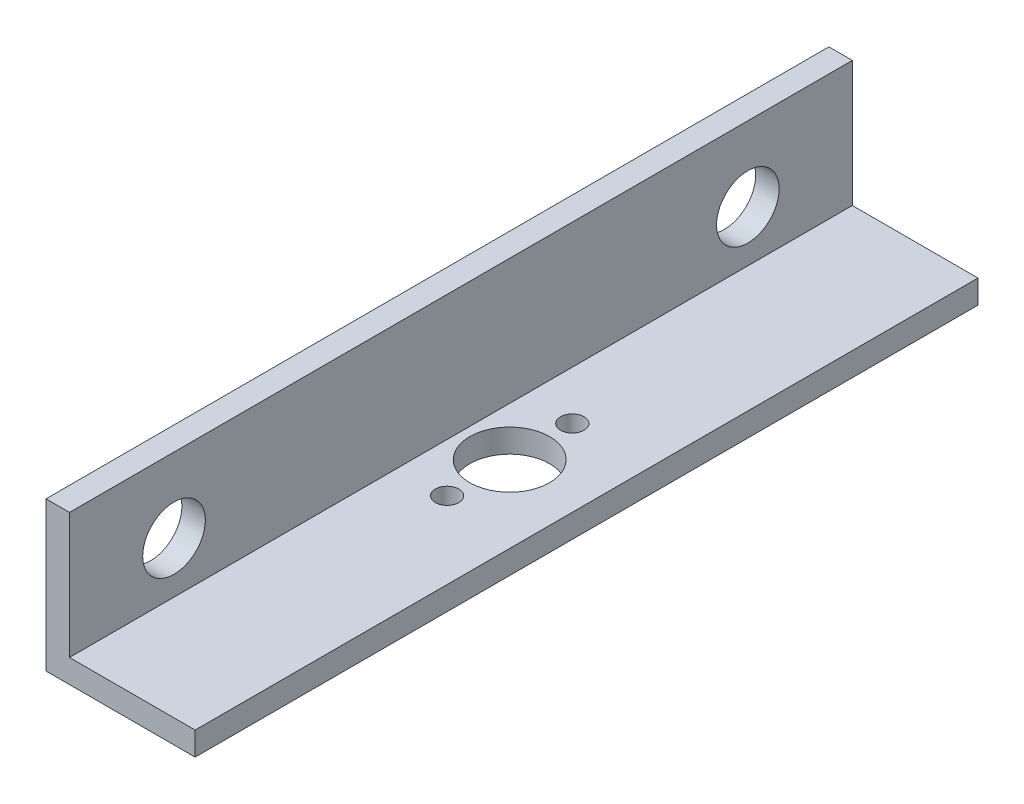
ISO-10303-21;
HEADER;
FILE_DESCRIPTION(('STEP AP214'),'2;1');
FILE_NAME('part.step','',(''),(''),'','','');
FILE_SCHEMA(('AUTOMOTIVE_DESIGN { 1 0 10303 214 1 1 1 1 }'));
ENDSEC;
DATA;
#1=APPLICATION_CONTEXT('core data for automotive mechanical design processes');
#2=APPLICATION_PROTOCOL_DEFINITION('international standard','automotive_design',2000,#1);
#3=PRODUCT_CONTEXT('',#1,'mechanical');
#4=PRODUCT('Part','Part','',(#3));
#5=PRODUCT_RELATED_PRODUCT_CATEGORY('part','',(#4));
#6=PRODUCT_DEFINITION_FORMATION('','',#4);
#7=PRODUCT_DEFINITION_CONTEXT('part definition',#1,'design');
#8=PRODUCT_DEFINITION('design','',#6,#7);
#9=PRODUCT_DEFINITION_SHAPE('','',#8);
#10=(LENGTH_UNIT() NAMED_UNIT(*) SI_UNIT(.MILLI.,.METRE.));
#11=(NAMED_UNIT(*) PLANE_ANGLE_UNIT() SI_UNIT($,.RADIAN.));
#12=(NAMED_UNIT(*) SI_UNIT($,.STERADIAN.) SOLID_ANGLE_UNIT());
#13=UNCERTAINTY_MEASURE_WITH_UNIT(LENGTH_MEASURE(1.E-05),#10,'distance_accuracy_value','');
#14=(GEOMETRIC_REPRESENTATION_CONTEXT(3) GLOBAL_UNCERTAINTY_ASSIGNED_CONTEXT((#13)) GLOBAL_UNIT_ASSIGNED_CONTEXT((#10,
#11,#12)) REPRESENTATION_CONTEXT('',''));
#15=CARTESIAN_POINT('',(0.,0.,0.));
#16=DIRECTION('',(0.,0.,1.));
#17=DIRECTION('',(1.,0.,0.));
#18=AXIS2_PLACEMENT_3D('',#15,#16,#17);
#19=CARTESIAN_POINT('',(3.,0.,50.));
#20=DIRECTION('',(-1.,0.,0.));
#21=DIRECTION('',(0.,0.,1.));
#22=AXIS2_PLACEMENT_3D('',#19,#20,#21);
#23=PLANE('',#22);
#24=CARTESIAN_POINT('',(3.,9.52500000000001,36.65));
#25=DIRECTION('',(-1.,0.,0.));
#26=DIRECTION('',(0.,0.,1.));
#27=AXIS2_PLACEMENT_3D('',#24,#25,#26);
#28=CIRCLE('',#27,3.99999999999999);
#29=CARTESIAN_POINT('',(3.,9.52500000000001,40.65));
#30=VERTEX_POINT('',#29);
#31=EDGE_CURVE('E164',#30,#30,#28,.F.);
#32=ORIENTED_EDGE('',*,*,#31,.F.);
#33=EDGE_LOOP('',(#32));
#34=FACE_BOUND('',#33,.T.);
#35=CARTESIAN_POINT('',(3.,9.52500000000001,-36.65));
#36=DIRECTION('',(-1.,0.,0.));
#37=DIRECTION('',(0.,0.,1.));
#38=AXIS2_PLACEMENT_3D('',#35,#36,#37);
#39=CIRCLE('',#38,3.99999999999999);
#40=CARTESIAN_POINT('',(3.,9.52500000000001,-32.65));
#41=VERTEX_POINT('',#40);
#42=EDGE_CURVE('E120',#41,#41,#39,.F.);
#43=ORIENTED_EDGE('',*,*,#42,.F.);
#44=EDGE_LOOP('',(#43));
#45=FACE_BOUND('',#44,.T.);
#46=DIRECTION('',(0.,1.,0.));
#47=VECTOR('',#46,1.);
#48=CARTESIAN_POINT('',(3.,0.,-50.));
#49=LINE('',#48,#47);
#50=CARTESIAN_POINT('',(3.,3.,-50.));
#51=VERTEX_POINT('',#50);
#52=CARTESIAN_POINT('',(3.,19.05,-50.));
#53=VERTEX_POINT('',#52);
#54=EDGE_CURVE('E116',#51,#53,#49,.T.);
#55=ORIENTED_EDGE('',*,*,#54,.T.);
#56=DIRECTION('',(0.,0.,-1.));
#57=VECTOR('',#56,1.);
#58=CARTESIAN_POINT('',(3.,19.05,50.));
#59=LINE('',#58,#57);
#60=CARTESIAN_POINT('',(3.,19.05,50.));
#61=VERTEX_POINT('',#60);
#62=EDGE_CURVE('E11',#61,#53,#59,.T.);
#63=ORIENTED_EDGE('',*,*,#62,.F.);
#64=DIRECTION('',(0.,1.,0.));
#65=VECTOR('',#64,1.);
#66=CARTESIAN_POINT('',(3.,0.,50.));
#67=LINE('',#66,#65);
#68=CARTESIAN_POINT('',(3.,3.,50.));
#69=VERTEX_POINT('',#68);
#70=EDGE_CURVE('E81',#69,#61,#67,.T.);
#71=ORIENTED_EDGE('',*,*,#70,.F.);
#72=DIRECTION('',(0.,0.,-1.));
#73=VECTOR('',#72,1.);
#74=CARTESIAN_POINT('',(3.,3.,50.));
#75=LINE('',#74,#73);
#76=EDGE_CURVE('E112',#69,#51,#75,.T.);
#77=ORIENTED_EDGE('',*,*,#76,.T.);
#78=EDGE_LOOP('',(#55,#63,#71,#77));
#79=FACE_BOUND('',#78,.T.);
#80=ADVANCED_FACE('F35',(#34,#45,#79),#23,.F.);
#81=CARTESIAN_POINT('',(0.,19.05,50.));
#82=DIRECTION('',(0.,1.,0.));
#83=DIRECTION('',(0.,0.,1.));
#84=AXIS2_PLACEMENT_3D('',#81,#82,#83);
#85=PLANE('',#84);
#86=DIRECTION('',(1.,0.,0.));
#87=VECTOR('',#86,1.);
#88=CARTESIAN_POINT('',(0.,19.05,-50.));
#89=LINE('',#88,#87);
#90=CARTESIAN_POINT('',(0.,19.05,-50.));
#91=VERTEX_POINT('',#90);
#92=EDGE_CURVE('E119',#91,#53,#89,.T.);
#93=ORIENTED_EDGE('',*,*,#92,.F.);
#94=DIRECTION('',(0.,0.,-1.));
#95=VECTOR('',#94,1.);
#96=CARTESIAN_POINT('',(0.,19.05,50.));
#97=LINE('',#96,#95);
#98=CARTESIAN_POINT('',(0.,19.05,50.));
#99=VERTEX_POINT('',#98);
#100=EDGE_CURVE('E43',#99,#91,#97,.T.);
#101=ORIENTED_EDGE('',*,*,#100,.F.);
#102=DIRECTION('',(1.,0.,0.));
#103=VECTOR('',#102,1.);
#104=CARTESIAN_POINT('',(0.,19.05,50.));
#105=LINE('',#104,#103);
#106=EDGE_CURVE('E175',#99,#61,#105,.T.);
#107=ORIENTED_EDGE('',*,*,#106,.T.);
#108=ORIENTED_EDGE('',*,*,#62,.T.);
#109=EDGE_LOOP('',(#93,#101,#107,#108));
#110=FACE_BOUND('',#109,.T.);
#111=ADVANCED_FACE('F138',(#110),#85,.T.);
#112=CARTESIAN_POINT('',(0.,0.,50.));
#113=DIRECTION('',(-1.,0.,0.));
#114=DIRECTION('',(0.,0.,1.));
#115=AXIS2_PLACEMENT_3D('',#112,#113,#114);
#116=PLANE('',#115);
#117=CARTESIAN_POINT('',(0.,9.52500000000001,36.65));
#118=DIRECTION('',(-1.,0.,0.));
#119=DIRECTION('',(0.,0.,1.));
#120=AXIS2_PLACEMENT_3D('',#117,#118,#119);
#121=CIRCLE('',#120,3.99999999999999);
#122=CARTESIAN_POINT('',(0.,9.52500000000001,40.65));
#123=VERTEX_POINT('',#122);
#124=EDGE_CURVE('E177',#123,#123,#121,.T.);
#125=ORIENTED_EDGE('',*,*,#124,.F.);
#126=EDGE_LOOP('',(#125));
#127=FACE_BOUND('',#126,.T.);
#128=CARTESIAN_POINT('',(0.,9.52500000000001,-36.65));
#129=DIRECTION('',(-1.,0.,0.));
#130=DIRECTION('',(0.,0.,1.));
#131=AXIS2_PLACEMENT_3D('',#128,#129,#130);
#132=CIRCLE('',#131,3.99999999999999);
#133=CARTESIAN_POINT('',(0.,9.52500000000001,-32.65));
#134=VERTEX_POINT('',#133);
#135=EDGE_CURVE('E168',#134,#134,#132,.T.);
#136=ORIENTED_EDGE('',*,*,#135,.F.);
#137=EDGE_LOOP('',(#136));
#138=FACE_BOUND('',#137,.T.);
#139=DIRECTION('',(0.,1.,0.));
#140=VECTOR('',#139,1.);
#141=CARTESIAN_POINT('',(0.,0.,-50.));
#142=LINE('',#141,#140);
#143=CARTESIAN_POINT('',(0.,0.,-50.));
#144=VERTEX_POINT('',#143);
#145=EDGE_CURVE('E123',#144,#91,#142,.T.);
#146=ORIENTED_EDGE('',*,*,#145,.F.);
#147=DIRECTION('',(0.,0.,-1.));
#148=VECTOR('',#147,1.);
#149=CARTESIAN_POINT('',(0.,0.,50.));
#150=LINE('',#149,#148);
#151=CARTESIAN_POINT('',(0.,0.,50.));
#152=VERTEX_POINT('',#151);
#153=EDGE_CURVE('E102',#152,#144,#150,.T.);
#154=ORIENTED_EDGE('',*,*,#153,.F.);
#155=DIRECTION('',(0.,1.,0.));
#156=VECTOR('',#155,1.);
#157=CARTESIAN_POINT('',(0.,0.,50.));
#158=LINE('',#157,#156);
#159=EDGE_CURVE('E108',#152,#99,#158,.T.);
#160=ORIENTED_EDGE('',*,*,#159,.T.);
#161=ORIENTED_EDGE('',*,*,#100,.T.);
#162=EDGE_LOOP('',(#146,#154,#160,#161));
#163=FACE_BOUND('',#162,.T.);
#164=ADVANCED_FACE('F135',(#127,#138,#163),#116,.T.);
#165=CARTESIAN_POINT('',(19.05,0.,50.));
#166=DIRECTION('',(0.,-1.,0.));
#167=DIRECTION('',(0.,0.,-1.));
#168=AXIS2_PLACEMENT_3D('',#165,#166,#167);
#169=PLANE('',#168);
#170=CARTESIAN_POINT('',(9.23,0.,-7.99999999999999));
#171=DIRECTION('',(0.,-1.,0.));
#172=DIRECTION('',(0.,0.,-1.));
#173=AXIS2_PLACEMENT_3D('',#170,#171,#172);
#174=CIRCLE('',#173,1.5);
#175=CARTESIAN_POINT('',(9.23,0.,-9.49999999999999));
#176=VERTEX_POINT('',#175);
#177=EDGE_CURVE('E190',#176,#176,#174,.T.);
#178=ORIENTED_EDGE('',*,*,#177,.F.);
#179=EDGE_LOOP('',(#178));
#180=FACE_BOUND('',#179,.T.);
#181=CARTESIAN_POINT('',(9.23,0.,8.00000000000001));
#182=DIRECTION('',(0.,-1.,0.));
#183=DIRECTION('',(0.,0.,-1.));
#184=AXIS2_PLACEMENT_3D('',#181,#182,#183);
#185=CIRCLE('',#184,1.5);
#186=CARTESIAN_POINT('',(9.23,0.,6.50000000000001));
#187=VERTEX_POINT('',#186);
#188=EDGE_CURVE('E191',#187,#187,#185,.T.);
#189=ORIENTED_EDGE('',*,*,#188,.F.);
#190=EDGE_LOOP('',(#189));
#191=FACE_BOUND('',#190,.T.);
#192=CARTESIAN_POINT('',(9.23,0.,0.));
#193=DIRECTION('',(0.,-1.,0.));
#194=DIRECTION('',(0.,0.,-1.));
#195=AXIS2_PLACEMENT_3D('',#192,#193,#194);
#196=CIRCLE('',#195,5.1);
#197=CARTESIAN_POINT('',(9.23,0.,-5.09999999999999));
#198=VERTEX_POINT('',#197);
#199=EDGE_CURVE('E183',#198,#198,#196,.T.);
#200=ORIENTED_EDGE('',*,*,#199,.F.);
#201=EDGE_LOOP('',(#200));
#202=FACE_BOUND('',#201,.T.);
#203=DIRECTION('',(-1.,0.,0.));
#204=VECTOR('',#203,1.);
#205=CARTESIAN_POINT('',(19.05,0.,-50.));
#206=LINE('',#205,#204);
#207=CARTESIAN_POINT('',(19.05,0.,-50.));
#208=VERTEX_POINT('',#207);
#209=EDGE_CURVE('E97',#208,#144,#206,.T.);
#210=ORIENTED_EDGE('',*,*,#209,.F.);
#211=DIRECTION('',(0.,0.,-1.));
#212=VECTOR('',#211,1.);
#213=CARTESIAN_POINT('',(19.05,0.,50.));
#214=LINE('',#213,#212);
#215=CARTESIAN_POINT('',(19.05,0.,50.));
#216=VERTEX_POINT('',#215);
#217=EDGE_CURVE('E92',#216,#208,#214,.T.);
#218=ORIENTED_EDGE('',*,*,#217,.F.);
#219=DIRECTION('',(-1.,0.,0.));
#220=VECTOR('',#219,1.);
#221=CARTESIAN_POINT('',(19.05,0.,50.));
#222=LINE('',#221,#220);
#223=EDGE_CURVE('E95',#216,#152,#222,.T.);
#224=ORIENTED_EDGE('',*,*,#223,.T.);
#225=ORIENTED_EDGE('',*,*,#153,.T.);
#226=EDGE_LOOP('',(#210,#218,#224,#225));
#227=FACE_BOUND('',#226,.T.);
#228=ADVANCED_FACE('F94',(#180,#191,#202,#227),#169,.T.);
#229=CARTESIAN_POINT('',(19.05,3.,50.));
#230=DIRECTION('',(1.,0.,0.));
#231=DIRECTION('',(0.,0.,-1.));
#232=AXIS2_PLACEMENT_3D('',#229,#230,#231);
#233=PLANE('',#232);
#234=DIRECTION('',(0.,-1.,0.));
#235=VECTOR('',#234,1.);
#236=CARTESIAN_POINT('',(19.05,3.,-50.));
#237=LINE('',#236,#235);
#238=CARTESIAN_POINT('',(19.05,3.,-50.));
#239=VERTEX_POINT('',#238);
#240=EDGE_CURVE('E127',#239,#208,#237,.T.);
#241=ORIENTED_EDGE('',*,*,#240,.F.);
#242=DIRECTION('',(0.,0.,-1.));
#243=VECTOR('',#242,1.);
#244=CARTESIAN_POINT('',(19.05,3.,50.));
#245=LINE('',#244,#243);
#246=CARTESIAN_POINT('',(19.05,3.,50.));
#247=VERTEX_POINT('',#246);
#248=EDGE_CURVE('E72',#247,#239,#245,.T.);
#249=ORIENTED_EDGE('',*,*,#248,.F.);
#250=DIRECTION('',(0.,-1.,0.));
#251=VECTOR('',#250,1.);
#252=CARTESIAN_POINT('',(19.05,3.,50.));
#253=LINE('',#252,#251);
#254=EDGE_CURVE('E106',#247,#216,#253,.T.);
#255=ORIENTED_EDGE('',*,*,#254,.T.);
#256=ORIENTED_EDGE('',*,*,#217,.T.);
#257=EDGE_LOOP('',(#241,#249,#255,#256));
#258=FACE_BOUND('',#257,.T.);
#259=ADVANCED_FACE('F110',(#258),#233,.T.);
#260=CARTESIAN_POINT('',(19.05,3.,50.));
#261=DIRECTION('',(0.,-1.,0.));
#262=DIRECTION('',(0.,0.,-1.));
#263=AXIS2_PLACEMENT_3D('',#260,#261,#262);
#264=PLANE('',#263);
#265=CARTESIAN_POINT('',(9.23,3.,-7.99999999999999));
#266=DIRECTION('',(0.,-1.,0.));
#267=DIRECTION('',(0.,0.,-1.));
#268=AXIS2_PLACEMENT_3D('',#265,#266,#267);
#269=CIRCLE('',#268,1.5);
#270=CARTESIAN_POINT('',(9.23,3.,-9.49999999999999));
#271=VERTEX_POINT('',#270);
#272=EDGE_CURVE('E186',#271,#271,#269,.F.);
#273=ORIENTED_EDGE('',*,*,#272,.F.);
#274=EDGE_LOOP('',(#273));
#275=FACE_BOUND('',#274,.T.);
#276=CARTESIAN_POINT('',(9.23,3.,8.00000000000001));
#277=DIRECTION('',(0.,-1.,0.));
#278=DIRECTION('',(0.,0.,-1.));
#279=AXIS2_PLACEMENT_3D('',#276,#277,#278);
#280=CIRCLE('',#279,1.5);
#281=CARTESIAN_POINT('',(9.23,3.,6.50000000000001));
#282=VERTEX_POINT('',#281);
#283=EDGE_CURVE('E187',#282,#282,#280,.F.);
#284=ORIENTED_EDGE('',*,*,#283,.F.);
#285=EDGE_LOOP('',(#284));
#286=FACE_BOUND('',#285,.T.);
#287=CARTESIAN_POINT('',(9.23,3.,0.));
#288=DIRECTION('',(0.,-1.,0.));
#289=DIRECTION('',(0.,0.,-1.));
#290=AXIS2_PLACEMENT_3D('',#287,#288,#289);
#291=CIRCLE('',#290,5.1);
#292=CARTESIAN_POINT('',(9.23,3.,-5.09999999999999));
#293=VERTEX_POINT('',#292);
#294=EDGE_CURVE('E180',#293,#293,#291,.F.);
#295=ORIENTED_EDGE('',*,*,#294,.F.);
#296=EDGE_LOOP('',(#295));
#297=FACE_BOUND('',#296,.T.);
#298=DIRECTION('',(1.,0.,0.));
#299=VECTOR('',#298,1.);
#300=CARTESIAN_POINT('',(19.05,3.,-50.));
#301=LINE('',#300,#299);
#302=EDGE_CURVE('E75',#239,#51,#301,.F.);
#303=ORIENTED_EDGE('',*,*,#302,.T.);
#304=ORIENTED_EDGE('',*,*,#76,.F.);
#305=DIRECTION('',(1.,0.,0.));
#306=VECTOR('',#305,1.);
#307=CARTESIAN_POINT('',(19.05,3.,50.));
#308=LINE('',#307,#306);
#309=EDGE_CURVE('E51',#247,#69,#308,.F.);
#310=ORIENTED_EDGE('',*,*,#309,.F.);
#311=ORIENTED_EDGE('',*,*,#248,.T.);
#312=EDGE_LOOP('',(#303,#304,#310,#311));
#313=FACE_BOUND('',#312,.T.);
#314=ADVANCED_FACE('F143',(#275,#286,#297,#313),#264,.F.);
#315=CARTESIAN_POINT('',(0.,0.,50.));
#316=DIRECTION('',(0.,0.,-1.));
#317=DIRECTION('',(-1.,0.,0.));
#318=AXIS2_PLACEMENT_3D('',#315,#316,#317);
#319=PLANE('',#318);
#320=ORIENTED_EDGE('',*,*,#70,.T.);
#321=ORIENTED_EDGE('',*,*,#106,.F.);
#322=ORIENTED_EDGE('',*,*,#159,.F.);
#323=ORIENTED_EDGE('',*,*,#223,.F.);
#324=ORIENTED_EDGE('',*,*,#254,.F.);
#325=ORIENTED_EDGE('',*,*,#309,.T.);
#326=EDGE_LOOP('',(#320,#321,#322,#323,#324,#325));
#327=FACE_BOUND('',#326,.T.);
#328=ADVANCED_FACE('F105',(#327),#319,.F.);
#329=CARTESIAN_POINT('',(0.,0.,-50.));
#330=DIRECTION('',(0.,0.,-1.));
#331=DIRECTION('',(-1.,0.,0.));
#332=AXIS2_PLACEMENT_3D('',#329,#330,#331);
#333=PLANE('',#332);
#334=ORIENTED_EDGE('',*,*,#54,.F.);
#335=ORIENTED_EDGE('',*,*,#302,.F.);
#336=ORIENTED_EDGE('',*,*,#240,.T.);
#337=ORIENTED_EDGE('',*,*,#209,.T.);
#338=ORIENTED_EDGE('',*,*,#145,.T.);
#339=ORIENTED_EDGE('',*,*,#92,.T.);
#340=EDGE_LOOP('',(#334,#335,#336,#337,#338,#339));
#341=FACE_BOUND('',#340,.T.);
#342=ADVANCED_FACE('F141',(#341),#333,.T.);
#343=CARTESIAN_POINT('',(19.051,9.52500000000001,-36.65));
#344=DIRECTION('',(-1.,0.,0.));
#345=DIRECTION('',(0.,0.,1.));
#346=AXIS2_PLACEMENT_3D('',#343,#344,#345);
#347=CYLINDRICAL_SURFACE('',#346,3.99999999999999);
#348=ORIENTED_EDGE('',*,*,#135,.T.);
#349=EDGE_LOOP('',(#348));
#350=FACE_BOUND('',#349,.T.);
#351=ORIENTED_EDGE('',*,*,#42,.T.);
#352=EDGE_LOOP('',(#351));
#353=FACE_BOUND('',#352,.T.);
#354=ADVANCED_FACE('F220',(#350,#353),#347,.F.);
#355=CARTESIAN_POINT('',(19.051,9.52500000000001,36.65));
#356=DIRECTION('',(-1.,0.,0.));
#357=DIRECTION('',(0.,0.,1.));
#358=AXIS2_PLACEMENT_3D('',#355,#356,#357);
#359=CYLINDRICAL_SURFACE('',#358,3.99999999999999);
#360=ORIENTED_EDGE('',*,*,#124,.T.);
#361=EDGE_LOOP('',(#360));
#362=FACE_BOUND('',#361,.T.);
#363=ORIENTED_EDGE('',*,*,#31,.T.);
#364=EDGE_LOOP('',(#363));
#365=FACE_BOUND('',#364,.T.);
#366=ADVANCED_FACE('F211',(#362,#365),#359,.F.);
#367=CARTESIAN_POINT('',(9.23,17.4249783362056,0.));
#368=DIRECTION('',(0.,-1.,0.));
#369=DIRECTION('',(0.,0.,-1.));
#370=AXIS2_PLACEMENT_3D('',#367,#368,#369);
#371=CYLINDRICAL_SURFACE('',#370,5.1);
#372=ORIENTED_EDGE('',*,*,#294,.T.);
#373=EDGE_LOOP('',(#372));
#374=FACE_BOUND('',#373,.T.);
#375=ORIENTED_EDGE('',*,*,#199,.T.);
#376=EDGE_LOOP('',(#375));
#377=FACE_BOUND('',#376,.T.);
#378=ADVANCED_FACE('F208',(#374,#377),#371,.F.);
#379=CARTESIAN_POINT('',(9.23,17.4249783362056,8.00000000000001));
#380=DIRECTION('',(0.,-1.,0.));
#381=DIRECTION('',(0.,0.,-1.));
#382=AXIS2_PLACEMENT_3D('',#379,#380,#381);
#383=CYLINDRICAL_SURFACE('',#382,1.5);
#384=ORIENTED_EDGE('',*,*,#283,.T.);
#385=EDGE_LOOP('',(#384));
#386=FACE_BOUND('',#385,.T.);
#387=ORIENTED_EDGE('',*,*,#188,.T.);
#388=EDGE_LOOP('',(#387));
#389=FACE_BOUND('',#388,.T.);
#390=ADVANCED_FACE('F210',(#386,#389),#383,.F.);
#391=CARTESIAN_POINT('',(9.23,17.4249783362056,-7.99999999999999));
#392=DIRECTION('',(0.,-1.,0.));
#393=DIRECTION('',(0.,0.,-1.));
#394=AXIS2_PLACEMENT_3D('',#391,#392,#393);
#395=CYLINDRICAL_SURFACE('',#394,1.5);
#396=ORIENTED_EDGE('',*,*,#272,.T.);
#397=EDGE_LOOP('',(#396));
#398=FACE_BOUND('',#397,.T.);
#399=ORIENTED_EDGE('',*,*,#177,.T.);
#400=EDGE_LOOP('',(#399));
#401=FACE_BOUND('',#400,.T.);
#402=ADVANCED_FACE('F199',(#398,#401),#395,.F.);
#403=CLOSED_SHELL('',(#80,#111,#164,#228,#259,#314,#328,#342,#354,#366,#378,#390,#402));
#404=MANIFOLD_SOLID_BREP('B2',#403);
#405=ADVANCED_BREP_SHAPE_REPRESENTATION('',(#18,#404),#14);
#406=SHAPE_DEFINITION_REPRESENTATION(#9,#405);
ENDSEC;
END-ISO-10303-21;
